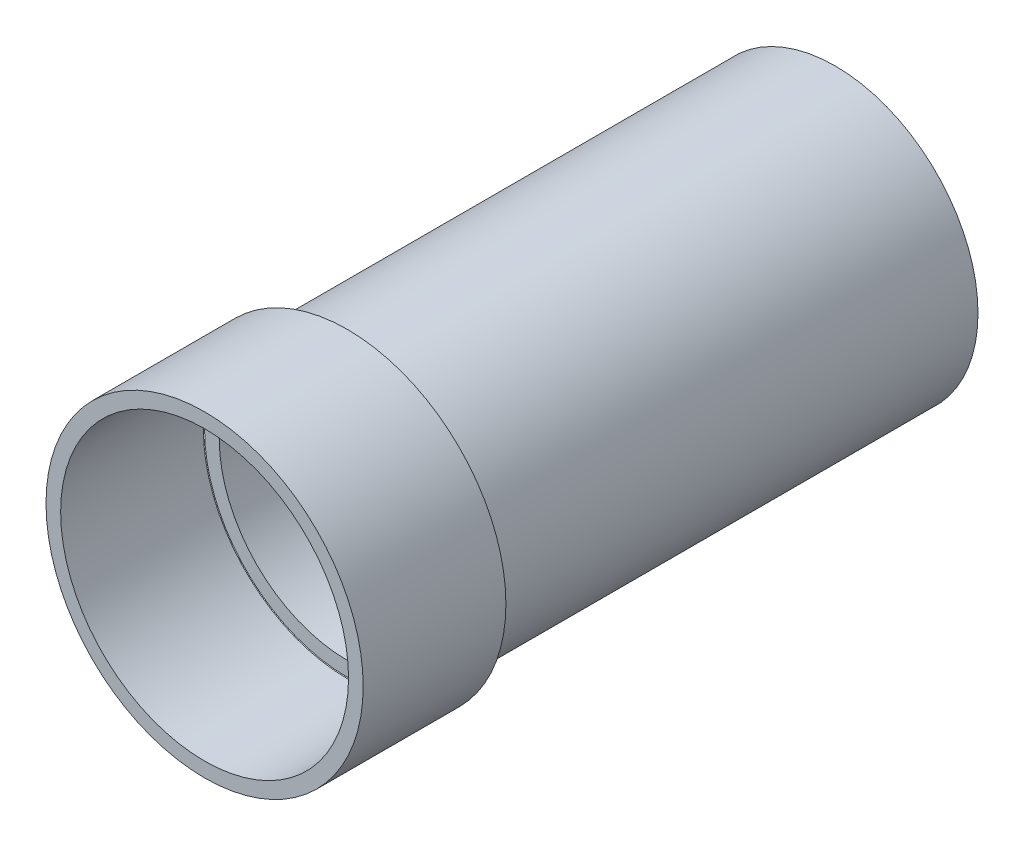
ISO-10303-21;
HEADER;
FILE_DESCRIPTION(('STEP AP214'),'2;1');
FILE_NAME('part.step','',(''),(''),'','','');
FILE_SCHEMA(('AUTOMOTIVE_DESIGN { 1 0 10303 214 1 1 1 1 }'));
ENDSEC;
DATA;
#1=APPLICATION_CONTEXT('core data for automotive mechanical design processes');
#2=APPLICATION_PROTOCOL_DEFINITION('international standard','automotive_design',2000,#1);
#3=PRODUCT_CONTEXT('',#1,'mechanical');
#4=PRODUCT('Part','Part','',(#3));
#5=PRODUCT_RELATED_PRODUCT_CATEGORY('part','',(#4));
#6=PRODUCT_DEFINITION_FORMATION('','',#4);
#7=PRODUCT_DEFINITION_CONTEXT('part definition',#1,'design');
#8=PRODUCT_DEFINITION('design','',#6,#7);
#9=PRODUCT_DEFINITION_SHAPE('','',#8);
#10=(LENGTH_UNIT() NAMED_UNIT(*) SI_UNIT(.MILLI.,.METRE.));
#11=(NAMED_UNIT(*) PLANE_ANGLE_UNIT() SI_UNIT($,.RADIAN.));
#12=(NAMED_UNIT(*) SI_UNIT($,.STERADIAN.) SOLID_ANGLE_UNIT());
#13=UNCERTAINTY_MEASURE_WITH_UNIT(LENGTH_MEASURE(1.E-05),#10,'distance_accuracy_value','');
#14=(GEOMETRIC_REPRESENTATION_CONTEXT(3) GLOBAL_UNCERTAINTY_ASSIGNED_CONTEXT((#13)) GLOBAL_UNIT_ASSIGNED_CONTEXT((#10,
#11,#12)) REPRESENTATION_CONTEXT('',''));
#15=CARTESIAN_POINT('',(0.,0.,0.));
#16=DIRECTION('',(0.,0.,1.));
#17=DIRECTION('',(1.,0.,0.));
#18=AXIS2_PLACEMENT_3D('',#15,#16,#17);
#19=CARTESIAN_POINT('',(0.,0.,103.4));
#20=DIRECTION('',(0.,0.,1.));
#21=DIRECTION('',(1.,0.,0.));
#22=AXIS2_PLACEMENT_3D('',#19,#20,#21);
#23=PLANE('',#22);
#24=CARTESIAN_POINT('',(0.,0.,103.4));
#25=DIRECTION('',(0.,0.,1.));
#26=DIRECTION('',(1.,0.,0.));
#27=AXIS2_PLACEMENT_3D('',#24,#25,#26);
#28=CIRCLE('',#27,26.);
#29=CARTESIAN_POINT('',(26.,0.,103.4));
#30=VERTEX_POINT('',#29);
#31=EDGE_CURVE('E11',#30,#30,#28,.T.);
#32=ORIENTED_EDGE('',*,*,#31,.T.);
#33=EDGE_LOOP('',(#32));
#34=FACE_BOUND('',#33,.T.);
#35=CARTESIAN_POINT('',(0.,0.,103.4));
#36=DIRECTION('',(0.,0.,1.));
#37=DIRECTION('',(1.,0.,0.));
#38=AXIS2_PLACEMENT_3D('',#35,#36,#37);
#39=CIRCLE('',#38,23.6);
#40=CARTESIAN_POINT('',(23.6,0.,103.4));
#41=VERTEX_POINT('',#40);
#42=EDGE_CURVE('E50',#41,#41,#39,.T.);
#43=ORIENTED_EDGE('',*,*,#42,.F.);
#44=EDGE_LOOP('',(#43));
#45=FACE_BOUND('',#44,.T.);
#46=ADVANCED_FACE('F39',(#34,#45),#23,.T.);
#47=CARTESIAN_POINT('',(0.,0.,80.));
#48=DIRECTION('',(0.,0.,1.));
#49=DIRECTION('',(1.,0.,0.));
#50=AXIS2_PLACEMENT_3D('',#47,#48,#49);
#51=PLANE('',#50);
#52=CARTESIAN_POINT('',(0.,0.,80.));
#53=DIRECTION('',(0.,0.,1.));
#54=DIRECTION('',(1.,0.,0.));
#55=AXIS2_PLACEMENT_3D('',#52,#53,#54);
#56=CIRCLE('',#55,26.);
#57=CARTESIAN_POINT('',(26.,0.,80.));
#58=VERTEX_POINT('',#57);
#59=EDGE_CURVE('E43',#58,#58,#56,.T.);
#60=ORIENTED_EDGE('',*,*,#59,.F.);
#61=EDGE_LOOP('',(#60));
#62=FACE_BOUND('',#61,.T.);
#63=CARTESIAN_POINT('',(0.,0.,80.));
#64=DIRECTION('',(0.,0.,1.));
#65=DIRECTION('',(1.,0.,0.));
#66=AXIS2_PLACEMENT_3D('',#63,#64,#65);
#67=CIRCLE('',#66,23.6);
#68=CARTESIAN_POINT('',(23.6,0.,80.));
#69=VERTEX_POINT('',#68);
#70=EDGE_CURVE('E52',#69,#69,#67,.T.);
#71=ORIENTED_EDGE('',*,*,#70,.T.);
#72=EDGE_LOOP('',(#71));
#73=FACE_BOUND('',#72,.T.);
#74=ADVANCED_FACE('F62',(#62,#73),#51,.F.);
#75=CARTESIAN_POINT('',(0.,0.,103.4));
#76=DIRECTION('',(0.,0.,-1.));
#77=DIRECTION('',(-1.,0.,0.));
#78=AXIS2_PLACEMENT_3D('',#75,#76,#77);
#79=CYLINDRICAL_SURFACE('',#78,26.);
#80=ORIENTED_EDGE('',*,*,#31,.F.);
#81=EDGE_LOOP('',(#80));
#82=FACE_BOUND('',#81,.T.);
#83=ORIENTED_EDGE('',*,*,#59,.T.);
#84=EDGE_LOOP('',(#83));
#85=FACE_BOUND('',#84,.T.);
#86=ADVANCED_FACE('F41',(#82,#85),#79,.T.);
#87=CARTESIAN_POINT('',(0.,0.,103.4));
#88=DIRECTION('',(0.,0.,-1.));
#89=DIRECTION('',(-1.,0.,0.));
#90=AXIS2_PLACEMENT_3D('',#87,#88,#89);
#91=CYLINDRICAL_SURFACE('',#90,23.6);
#92=ORIENTED_EDGE('',*,*,#42,.T.);
#93=EDGE_LOOP('',(#92));
#94=FACE_BOUND('',#93,.T.);
#95=ORIENTED_EDGE('',*,*,#70,.F.);
#96=EDGE_LOOP('',(#95));
#97=FACE_BOUND('',#96,.T.);
#98=ADVANCED_FACE('F58',(#94,#97),#91,.F.);
#99=CLOSED_SHELL('',(#46,#74,#86,#98));
#100=MANIFOLD_SOLID_BREP('B2',#99);
#101=CARTESIAN_POINT('',(0.,0.,80.));
#102=DIRECTION('',(0.,0.,1.));
#103=DIRECTION('',(1.,0.,0.));
#104=AXIS2_PLACEMENT_3D('',#101,#102,#103);
#105=PLANE('',#104);
#106=CARTESIAN_POINT('',(0.,0.,80.));
#107=DIRECTION('',(0.,0.,1.));
#108=DIRECTION('',(1.,0.,0.));
#109=AXIS2_PLACEMENT_3D('',#106,#107,#108);
#110=CIRCLE('',#109,23.4);
#111=CARTESIAN_POINT('',(23.4,0.,80.));
#112=VERTEX_POINT('',#111);
#113=EDGE_CURVE('E38',#112,#112,#110,.T.);
#114=ORIENTED_EDGE('',*,*,#113,.T.);
#115=EDGE_LOOP('',(#114));
#116=FACE_BOUND('',#115,.T.);
#117=CARTESIAN_POINT('',(0.,0.,80.));
#118=DIRECTION('',(0.,0.,1.));
#119=DIRECTION('',(1.,0.,0.));
#120=AXIS2_PLACEMENT_3D('',#117,#118,#119);
#121=CIRCLE('',#120,21.);
#122=CARTESIAN_POINT('',(21.,0.,80.));
#123=VERTEX_POINT('',#122);
#124=EDGE_CURVE('E112',#123,#123,#121,.T.);
#125=ORIENTED_EDGE('',*,*,#124,.F.);
#126=EDGE_LOOP('',(#125));
#127=FACE_BOUND('',#126,.T.);
#128=ADVANCED_FACE('F101',(#116,#127),#105,.T.);
#129=CARTESIAN_POINT('',(0.,0.,0.));
#130=DIRECTION('',(0.,0.,1.));
#131=DIRECTION('',(1.,0.,0.));
#132=AXIS2_PLACEMENT_3D('',#129,#130,#131);
#133=PLANE('',#132);
#134=CARTESIAN_POINT('',(0.,0.,0.));
#135=DIRECTION('',(0.,0.,1.));
#136=DIRECTION('',(1.,0.,0.));
#137=AXIS2_PLACEMENT_3D('',#134,#135,#136);
#138=CIRCLE('',#137,23.4);
#139=CARTESIAN_POINT('',(23.4,0.,0.));
#140=VERTEX_POINT('',#139);
#141=EDGE_CURVE('E105',#140,#140,#138,.T.);
#142=ORIENTED_EDGE('',*,*,#141,.F.);
#143=EDGE_LOOP('',(#142));
#144=FACE_BOUND('',#143,.T.);
#145=CARTESIAN_POINT('',(0.,0.,0.));
#146=DIRECTION('',(0.,0.,1.));
#147=DIRECTION('',(1.,0.,0.));
#148=AXIS2_PLACEMENT_3D('',#145,#146,#147);
#149=CIRCLE('',#148,21.);
#150=CARTESIAN_POINT('',(21.,0.,0.));
#151=VERTEX_POINT('',#150);
#152=EDGE_CURVE('E114',#151,#151,#149,.T.);
#153=ORIENTED_EDGE('',*,*,#152,.T.);
#154=EDGE_LOOP('',(#153));
#155=FACE_BOUND('',#154,.T.);
#156=ADVANCED_FACE('F124',(#144,#155),#133,.F.);
#157=CARTESIAN_POINT('',(0.,0.,80.));
#158=DIRECTION('',(0.,0.,-1.));
#159=DIRECTION('',(-1.,0.,0.));
#160=AXIS2_PLACEMENT_3D('',#157,#158,#159);
#161=CYLINDRICAL_SURFACE('',#160,23.4);
#162=ORIENTED_EDGE('',*,*,#113,.F.);
#163=EDGE_LOOP('',(#162));
#164=FACE_BOUND('',#163,.T.);
#165=ORIENTED_EDGE('',*,*,#141,.T.);
#166=EDGE_LOOP('',(#165));
#167=FACE_BOUND('',#166,.T.);
#168=ADVANCED_FACE('F103',(#164,#167),#161,.T.);
#169=CARTESIAN_POINT('',(0.,0.,80.));
#170=DIRECTION('',(0.,0.,-1.));
#171=DIRECTION('',(-1.,0.,0.));
#172=AXIS2_PLACEMENT_3D('',#169,#170,#171);
#173=CYLINDRICAL_SURFACE('',#172,21.);
#174=ORIENTED_EDGE('',*,*,#124,.T.);
#175=EDGE_LOOP('',(#174));
#176=FACE_BOUND('',#175,.T.);
#177=ORIENTED_EDGE('',*,*,#152,.F.);
#178=EDGE_LOOP('',(#177));
#179=FACE_BOUND('',#178,.T.);
#180=ADVANCED_FACE('F120',(#176,#179),#173,.F.);
#181=CLOSED_SHELL('',(#128,#156,#168,#180));
#182=MANIFOLD_SOLID_BREP('B6',#181);
#183=ADVANCED_BREP_SHAPE_REPRESENTATION('',(#18,#100,#182),#14);
#184=SHAPE_DEFINITION_REPRESENTATION(#9,#183);
ENDSEC;
END-ISO-10303-21;
